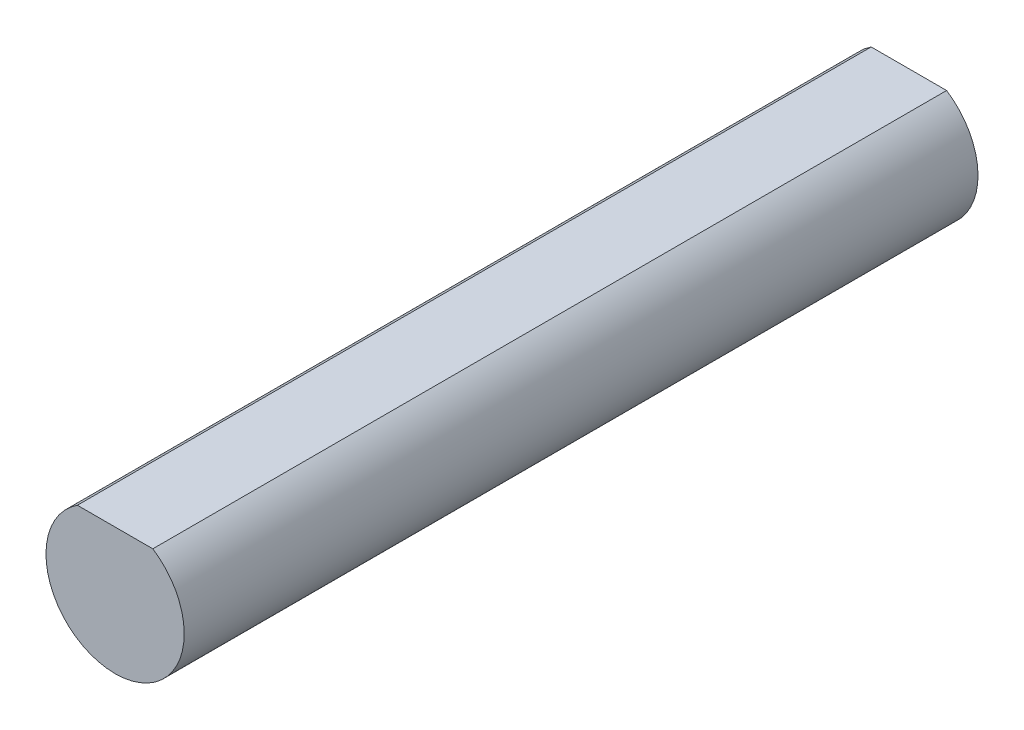
ISO-10303-21;
HEADER;
FILE_DESCRIPTION(('STEP AP214'),'2;1');
FILE_NAME('part.step','',(''),(''),'','','');
FILE_SCHEMA(('AUTOMOTIVE_DESIGN { 1 0 10303 214 1 1 1 1 }'));
ENDSEC;
DATA;
#1=APPLICATION_CONTEXT('core data for automotive mechanical design processes');
#2=APPLICATION_PROTOCOL_DEFINITION('international standard','automotive_design',2000,#1);
#3=PRODUCT_CONTEXT('',#1,'mechanical');
#4=PRODUCT('Part','Part','',(#3));
#5=PRODUCT_RELATED_PRODUCT_CATEGORY('part','',(#4));
#6=PRODUCT_DEFINITION_FORMATION('','',#4);
#7=PRODUCT_DEFINITION_CONTEXT('part definition',#1,'design');
#8=PRODUCT_DEFINITION('design','',#6,#7);
#9=PRODUCT_DEFINITION_SHAPE('','',#8);
#10=(LENGTH_UNIT() NAMED_UNIT(*) SI_UNIT(.MILLI.,.METRE.));
#11=(NAMED_UNIT(*) PLANE_ANGLE_UNIT() SI_UNIT($,.RADIAN.));
#12=(NAMED_UNIT(*) SI_UNIT($,.STERADIAN.) SOLID_ANGLE_UNIT());
#13=UNCERTAINTY_MEASURE_WITH_UNIT(LENGTH_MEASURE(1.E-05),#10,'distance_accuracy_value','');
#14=(GEOMETRIC_REPRESENTATION_CONTEXT(3) GLOBAL_UNCERTAINTY_ASSIGNED_CONTEXT((#13)) GLOBAL_UNIT_ASSIGNED_CONTEXT((#10,
#11,#12)) REPRESENTATION_CONTEXT('',''));
#15=CARTESIAN_POINT('',(0.,0.,0.));
#16=DIRECTION('',(0.,0.,1.));
#17=DIRECTION('',(1.,0.,0.));
#18=AXIS2_PLACEMENT_3D('',#15,#16,#17);
#19=CARTESIAN_POINT('',(0.,0.,85.));
#20=DIRECTION('',(0.,0.,-1.));
#21=DIRECTION('',(-1.,0.,0.));
#22=AXIS2_PLACEMENT_3D('',#19,#20,#21);
#23=CYLINDRICAL_SURFACE('',#22,7.4);
#24=CARTESIAN_POINT('',(0.,0.,85.));
#25=DIRECTION('',(0.,0.,1.));
#26=DIRECTION('',(1.,0.,0.));
#27=AXIS2_PLACEMENT_3D('',#24,#25,#26);
#28=CIRCLE('',#27,7.4);
#29=CARTESIAN_POINT('',(-4.03980197534483,6.2,85.));
#30=VERTEX_POINT('',#29);
#31=CARTESIAN_POINT('',(4.03980197534483,6.2,85.));
#32=VERTEX_POINT('',#31);
#33=EDGE_CURVE('E42',#30,#32,#28,.T.);
#34=ORIENTED_EDGE('',*,*,#33,.F.);
#35=DIRECTION('',(0.,0.,-1.));
#36=VECTOR('',#35,1.);
#37=CARTESIAN_POINT('',(-4.03980197534483,6.2,85.));
#38=LINE('',#37,#36);
#39=CARTESIAN_POINT('',(-4.03980197534483,6.2,0.));
#40=VERTEX_POINT('',#39);
#41=EDGE_CURVE('E56',#30,#40,#38,.T.);
#42=ORIENTED_EDGE('',*,*,#41,.T.);
#43=CARTESIAN_POINT('',(0.,0.,0.));
#44=DIRECTION('',(0.,0.,1.));
#45=DIRECTION('',(1.,0.,0.));
#46=AXIS2_PLACEMENT_3D('',#43,#44,#45);
#47=CIRCLE('',#46,7.4);
#48=CARTESIAN_POINT('',(4.03980197534483,6.2,0.));
#49=VERTEX_POINT('',#48);
#50=EDGE_CURVE('E64',#40,#49,#47,.T.);
#51=ORIENTED_EDGE('',*,*,#50,.T.);
#52=DIRECTION('',(0.,0.,-1.));
#53=VECTOR('',#52,1.);
#54=CARTESIAN_POINT('',(4.03980197534483,6.2,85.));
#55=LINE('',#54,#53);
#56=EDGE_CURVE('E49',#49,#32,#55,.F.);
#57=ORIENTED_EDGE('',*,*,#56,.T.);
#58=EDGE_LOOP('',(#34,#42,#51,#57));
#59=FACE_BOUND('',#58,.T.);
#60=ADVANCED_FACE('F35',(#59),#23,.T.);
#61=CARTESIAN_POINT('',(0.,0.,85.));
#62=DIRECTION('',(0.,0.,1.));
#63=DIRECTION('',(1.,0.,0.));
#64=AXIS2_PLACEMENT_3D('',#61,#62,#63);
#65=PLANE('',#64);
#66=DIRECTION('',(1.,0.,0.));
#67=VECTOR('',#66,1.);
#68=CARTESIAN_POINT('',(-11.461385925178,6.2,85.));
#69=LINE('',#68,#67);
#70=EDGE_CURVE('E59',#30,#32,#69,.T.);
#71=ORIENTED_EDGE('',*,*,#70,.F.);
#72=ORIENTED_EDGE('',*,*,#33,.T.);
#73=EDGE_LOOP('',(#71,#72));
#74=FACE_BOUND('',#73,.T.);
#75=ADVANCED_FACE('F68',(#74),#65,.T.);
#76=CARTESIAN_POINT('',(0.,0.,0.));
#77=DIRECTION('',(0.,0.,1.));
#78=DIRECTION('',(1.,0.,0.));
#79=AXIS2_PLACEMENT_3D('',#76,#77,#78);
#80=PLANE('',#79);
#81=ORIENTED_EDGE('',*,*,#50,.F.);
#82=DIRECTION('',(1.,0.,0.));
#83=VECTOR('',#82,1.);
#84=CARTESIAN_POINT('',(0.,6.2,0.));
#85=LINE('',#84,#83);
#86=EDGE_CURVE('E11',#40,#49,#85,.T.);
#87=ORIENTED_EDGE('',*,*,#86,.T.);
#88=EDGE_LOOP('',(#81,#87));
#89=FACE_BOUND('',#88,.T.);
#90=ADVANCED_FACE('F73',(#89),#80,.F.);
#91=CARTESIAN_POINT('',(-11.461385925178,6.2,0.));
#92=DIRECTION('',(0.,-1.,0.));
#93=DIRECTION('',(0.,0.,-1.));
#94=AXIS2_PLACEMENT_3D('',#91,#92,#93);
#95=PLANE('',#94);
#96=ORIENTED_EDGE('',*,*,#70,.T.);
#97=ORIENTED_EDGE('',*,*,#56,.F.);
#98=ORIENTED_EDGE('',*,*,#86,.F.);
#99=ORIENTED_EDGE('',*,*,#41,.F.);
#100=EDGE_LOOP('',(#96,#97,#98,#99));
#101=FACE_BOUND('',#100,.T.);
#102=ADVANCED_FACE('F58',(#101),#95,.F.);
#103=CLOSED_SHELL('',(#60,#75,#90,#102));
#104=MANIFOLD_SOLID_BREP('B2',#103);
#105=ADVANCED_BREP_SHAPE_REPRESENTATION('',(#18,#104),#14);
#106=SHAPE_DEFINITION_REPRESENTATION(#9,#105);
ENDSEC;
END-ISO-10303-21;
